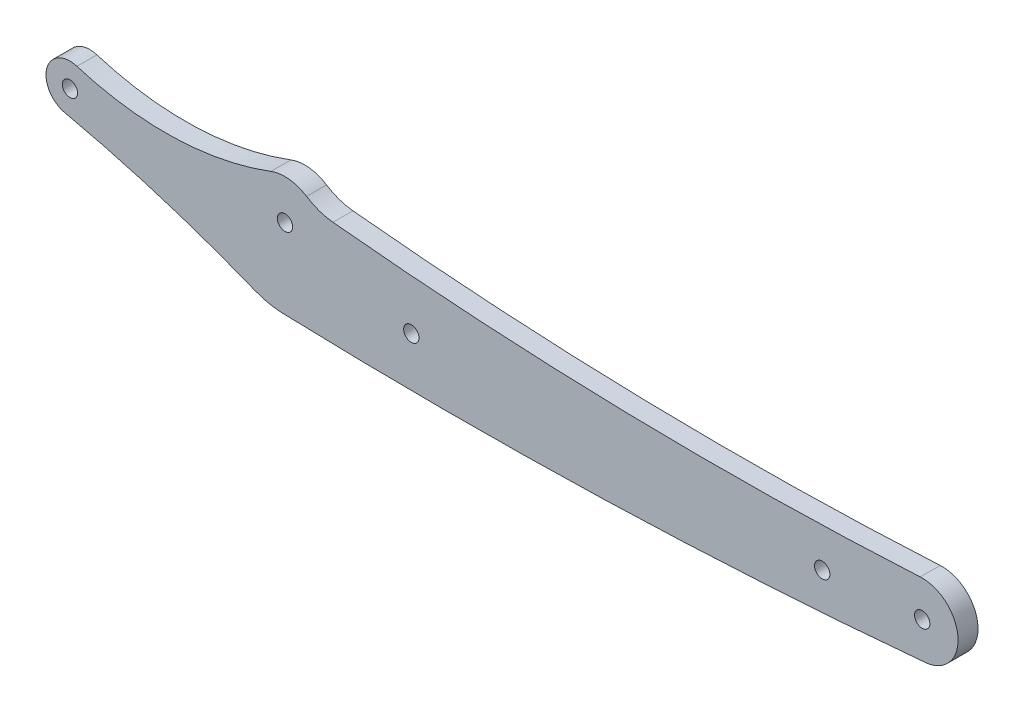
ISO-10303-21;
HEADER;
FILE_DESCRIPTION(('STEP AP214'),'2;1');
FILE_NAME('part.step','',(''),(''),'','','');
FILE_SCHEMA(('AUTOMOTIVE_DESIGN { 1 0 10303 214 1 1 1 1 }'));
ENDSEC;
DATA;
#1=APPLICATION_CONTEXT('core data for automotive mechanical design processes');
#2=APPLICATION_PROTOCOL_DEFINITION('international standard','automotive_design',2000,#1);
#3=PRODUCT_CONTEXT('',#1,'mechanical');
#4=PRODUCT('Part','Part','',(#3));
#5=PRODUCT_RELATED_PRODUCT_CATEGORY('part','',(#4));
#6=PRODUCT_DEFINITION_FORMATION('','',#4);
#7=PRODUCT_DEFINITION_CONTEXT('part definition',#1,'design');
#8=PRODUCT_DEFINITION('design','',#6,#7);
#9=PRODUCT_DEFINITION_SHAPE('','',#8);
#10=(LENGTH_UNIT() NAMED_UNIT(*) SI_UNIT(.MILLI.,.METRE.));
#11=(NAMED_UNIT(*) PLANE_ANGLE_UNIT() SI_UNIT($,.RADIAN.));
#12=(NAMED_UNIT(*) SI_UNIT($,.STERADIAN.) SOLID_ANGLE_UNIT());
#13=UNCERTAINTY_MEASURE_WITH_UNIT(LENGTH_MEASURE(1.E-05),#10,'distance_accuracy_value','');
#14=(GEOMETRIC_REPRESENTATION_CONTEXT(3) GLOBAL_UNCERTAINTY_ASSIGNED_CONTEXT((#13)) GLOBAL_UNIT_ASSIGNED_CONTEXT((#10,
#11,#12)) REPRESENTATION_CONTEXT('',''));
#15=CARTESIAN_POINT('',(0.,0.,0.));
#16=DIRECTION('',(0.,0.,1.));
#17=DIRECTION('',(1.,0.,0.));
#18=AXIS2_PLACEMENT_3D('',#15,#16,#17);
#19=CARTESIAN_POINT('',(78.492038314304,478.023990244628,5.));
#20=DIRECTION('',(0.,0.,1.));
#21=DIRECTION('',(1.,0.,0.));
#22=AXIS2_PLACEMENT_3D('',#19,#20,#21);
#23=PLANE('',#22);
#24=CARTESIAN_POINT('',(-55.1729185121397,5.52644600065499,5.));
#25=DIRECTION('',(0.,0.,1.));
#26=DIRECTION('',(1.,0.,0.));
#27=AXIS2_PLACEMENT_3D('',#24,#25,#26);
#28=CIRCLE('',#27,1.92500000000007);
#29=CARTESIAN_POINT('',(-53.2479185121397,5.52644600065499,5.));
#30=VERTEX_POINT('',#29);
#31=EDGE_CURVE('E209',#30,#30,#28,.T.);
#32=ORIENTED_EDGE('',*,*,#31,.F.);
#33=EDGE_LOOP('',(#32));
#34=FACE_BOUND('',#33,.T.);
#35=CARTESIAN_POINT('',(79.6128747171377,-2.57478498942176,5.));
#36=DIRECTION('',(0.,0.,1.));
#37=DIRECTION('',(1.,0.,0.));
#38=AXIS2_PLACEMENT_3D('',#35,#36,#37);
#39=CIRCLE('',#38,1.92500000000007);
#40=CARTESIAN_POINT('',(81.5378747171378,-2.57478498942176,5.));
#41=VERTEX_POINT('',#40);
#42=EDGE_CURVE('E197',#41,#41,#39,.T.);
#43=ORIENTED_EDGE('',*,*,#42,.F.);
#44=EDGE_LOOP('',(#43));
#45=FACE_BOUND('',#44,.T.);
#46=CARTESIAN_POINT('',(104.703572766013,-0.75905609440774,5.));
#47=DIRECTION('',(0.,0.,1.));
#48=DIRECTION('',(1.,0.,0.));
#49=AXIS2_PLACEMENT_3D('',#46,#47,#48);
#50=CIRCLE('',#49,9.00000000000038);
#51=CARTESIAN_POINT('',(105.525948354053,-9.7214050271488,5.));
#52=VERTEX_POINT('',#51);
#53=CARTESIAN_POINT('',(104.21159401718,8.22748700684695,5.));
#54=VERTEX_POINT('',#53);
#55=EDGE_CURVE('E152',#52,#54,#50,.T.);
#56=ORIENTED_EDGE('',*,*,#55,.T.);
#57=CARTESIAN_POINT('',(52.2805038625947,956.807036583663,5.));
#58=DIRECTION('',(0.,0.,-1.));
#59=DIRECTION('',(1.,0.,0.));
#60=AXIS2_PLACEMENT_3D('',#57,#58,#59);
#61=CIRCLE('',#60,950.);
#62=CARTESIAN_POINT('',(-43.1266054492813,11.6099759170786,5.));
#63=VERTEX_POINT('',#62);
#64=EDGE_CURVE('E95',#54,#63,#61,.T.);
#65=ORIENTED_EDGE('',*,*,#64,.T.);
#66=CARTESIAN_POINT('',(-41.6201774075149,26.5341400328667,5.));
#67=DIRECTION('',(0.,0.,-1.));
#68=DIRECTION('',(1.,0.,0.));
#69=AXIS2_PLACEMENT_3D('',#66,#67,#68);
#70=CIRCLE('',#69,14.9999999999999);
#71=CARTESIAN_POINT('',(-49.751822070291,13.9295236135406,5.));
#72=VERTEX_POINT('',#71);
#73=EDGE_CURVE('E170',#63,#72,#70,.T.);
#74=ORIENTED_EDGE('',*,*,#73,.T.);
#75=CARTESIAN_POINT('',(-55.1729185121397,5.52644600065499,5.));
#76=DIRECTION('',(0.,0.,1.));
#77=DIRECTION('',(1.,0.,0.));
#78=AXIS2_PLACEMENT_3D('',#75,#76,#77);
#79=CIRCLE('',#78,10.0000000000002);
#80=CARTESIAN_POINT('',(-58.7079501836173,14.8807792789627,5.));
#81=VERTEX_POINT('',#80);
#82=EDGE_CURVE('E187',#72,#81,#79,.T.);
#83=ORIENTED_EDGE('',*,*,#82,.T.);
#84=CARTESIAN_POINT('',(-85.2206877197262,85.0382788662583,5.));
#85=DIRECTION('',(0.,0.,-1.));
#86=DIRECTION('',(1.,0.,0.));
#87=AXIS2_PLACEMENT_3D('',#84,#85,#86);
#88=CIRCLE('',#87,74.9999999999998);
#89=CARTESIAN_POINT('',(-107.360082718605,13.3804308028147,5.));
#90=VERTEX_POINT('',#89);
#91=EDGE_CURVE('E186',#81,#90,#88,.T.);
#92=ORIENTED_EDGE('',*,*,#91,.T.);
#93=CARTESIAN_POINT('',(-109.131234318516,7.64780295773893,5.));
#94=DIRECTION('',(0.,0.,1.));
#95=DIRECTION('',(1.,0.,0.));
#96=AXIS2_PLACEMENT_3D('',#93,#94,#95);
#97=CIRCLE('',#96,6.00000000000025);
#98=CARTESIAN_POINT('',(-110.424129779016,1.788756846961,5.));
#99=VERTEX_POINT('',#98);
#100=EDGE_CURVE('E117',#90,#99,#97,.T.);
#101=ORIENTED_EDGE('',*,*,#100,.T.);
#102=CARTESIAN_POINT('',(-175.068902804029,-291.163548691918,5.));
#103=DIRECTION('',(0.,0.,-1.));
#104=DIRECTION('',(1.,0.,0.));
#105=AXIS2_PLACEMENT_3D('',#102,#103,#104);
#106=CIRCLE('',#105,300.);
#107=CARTESIAN_POINT('',(-62.6664175303815,-13.0166786676315,5.));
#108=VERTEX_POINT('',#107);
#109=EDGE_CURVE('E111',#99,#108,#106,.T.);
#110=ORIENTED_EDGE('',*,*,#109,.T.);
#111=CARTESIAN_POINT('',(-55.1729185121397,5.52644600065499,5.));
#112=DIRECTION('',(0.,0.,1.));
#113=DIRECTION('',(1.,0.,0.));
#114=AXIS2_PLACEMENT_3D('',#111,#112,#113);
#115=CIRCLE('',#114,20.0000000000001);
#116=CARTESIAN_POINT('',(-55.8277822922507,-14.4628299599576,5.));
#117=VERTEX_POINT('',#116);
#118=EDGE_CURVE('E115',#108,#117,#115,.T.);
#119=ORIENTED_EDGE('',*,*,#118,.T.);
#120=CARTESIAN_POINT('',(-13.2616365850698,1284.84010747982,5.));
#121=DIRECTION('',(0.,0.,1.));
#122=DIRECTION('',(1.,0.,0.));
#123=AXIS2_PLACEMENT_3D('',#120,#121,#122);
#124=CIRCLE('',#123,1300.);
#125=EDGE_CURVE('E49',#117,#52,#124,.T.);
#126=ORIENTED_EDGE('',*,*,#125,.T.);
#127=EDGE_LOOP('',(#56,#65,#74,#83,#92,#101,#110,#119,#126));
#128=FACE_BOUND('',#127,.T.);
#129=CARTESIAN_POINT('',(-23.4726109731679,-2.72525091177656,5.));
#130=DIRECTION('',(0.,0.,1.));
#131=DIRECTION('',(1.,0.,0.));
#132=AXIS2_PLACEMENT_3D('',#129,#130,#131);
#133=CIRCLE('',#132,1.92500000000007);
#134=CARTESIAN_POINT('',(-21.5476109731678,-2.72525091177656,5.));
#135=VERTEX_POINT('',#134);
#136=EDGE_CURVE('E139',#135,#135,#133,.T.);
#137=ORIENTED_EDGE('',*,*,#136,.F.);
#138=EDGE_LOOP('',(#137));
#139=FACE_BOUND('',#138,.T.);
#140=CARTESIAN_POINT('',(-109.131234318516,7.64780295773893,5.));
#141=DIRECTION('',(0.,0.,1.));
#142=DIRECTION('',(1.,0.,0.));
#143=AXIS2_PLACEMENT_3D('',#140,#141,#142);
#144=CIRCLE('',#143,1.92500000000007);
#145=CARTESIAN_POINT('',(-107.206234318516,7.64780295773893,5.));
#146=VERTEX_POINT('',#145);
#147=EDGE_CURVE('E203',#146,#146,#144,.T.);
#148=ORIENTED_EDGE('',*,*,#147,.F.);
#149=EDGE_LOOP('',(#148));
#150=FACE_BOUND('',#149,.T.);
#151=CARTESIAN_POINT('',(104.703572766013,-0.75905609440774,5.));
#152=DIRECTION('',(0.,0.,1.));
#153=DIRECTION('',(1.,0.,0.));
#154=AXIS2_PLACEMENT_3D('',#151,#152,#153);
#155=CIRCLE('',#154,1.92500000000007);
#156=CARTESIAN_POINT('',(106.628572766013,-0.75905609440774,5.));
#157=VERTEX_POINT('',#156);
#158=EDGE_CURVE('E215',#157,#157,#155,.T.);
#159=ORIENTED_EDGE('',*,*,#158,.F.);
#160=EDGE_LOOP('',(#159));
#161=FACE_BOUND('',#160,.T.);
#162=ADVANCED_FACE('F32',(#34,#45,#128,#139,#150,#161),#23,.T.);
#163=CARTESIAN_POINT('',(78.492038314304,478.023990244628,0.));
#164=DIRECTION('',(0.,0.,1.));
#165=DIRECTION('',(1.,0.,0.));
#166=AXIS2_PLACEMENT_3D('',#163,#164,#165);
#167=PLANE('',#166);
#168=CARTESIAN_POINT('',(104.703572766013,-0.75905609440774,0.));
#169=DIRECTION('',(0.,0.,1.));
#170=DIRECTION('',(1.,0.,0.));
#171=AXIS2_PLACEMENT_3D('',#168,#169,#170);
#172=CIRCLE('',#171,9.00000000000038);
#173=CARTESIAN_POINT('',(105.525948354053,-9.7214050271488,0.));
#174=VERTEX_POINT('',#173);
#175=CARTESIAN_POINT('',(104.21159401718,8.22748700684695,0.));
#176=VERTEX_POINT('',#175);
#177=EDGE_CURVE('E135',#174,#176,#172,.T.);
#178=ORIENTED_EDGE('',*,*,#177,.F.);
#179=CARTESIAN_POINT('',(-13.2616365850698,1284.84010747982,0.));
#180=DIRECTION('',(0.,0.,1.));
#181=DIRECTION('',(1.,0.,0.));
#182=AXIS2_PLACEMENT_3D('',#179,#180,#181);
#183=CIRCLE('',#182,1300.);
#184=CARTESIAN_POINT('',(-55.8277822922507,-14.4628299599576,0.));
#185=VERTEX_POINT('',#184);
#186=EDGE_CURVE('E87',#185,#174,#183,.T.);
#187=ORIENTED_EDGE('',*,*,#186,.F.);
#188=CARTESIAN_POINT('',(-55.1729185121397,5.52644600065499,0.));
#189=DIRECTION('',(0.,0.,1.));
#190=DIRECTION('',(1.,0.,0.));
#191=AXIS2_PLACEMENT_3D('',#188,#189,#190);
#192=CIRCLE('',#191,20.0000000000001);
#193=CARTESIAN_POINT('',(-62.6664175303815,-13.0166786676315,0.));
#194=VERTEX_POINT('',#193);
#195=EDGE_CURVE('E81',#194,#185,#192,.T.);
#196=ORIENTED_EDGE('',*,*,#195,.F.);
#197=CARTESIAN_POINT('',(-175.068902804029,-291.163548691918,0.));
#198=DIRECTION('',(0.,0.,-1.));
#199=DIRECTION('',(1.,0.,0.));
#200=AXIS2_PLACEMENT_3D('',#197,#198,#199);
#201=CIRCLE('',#200,300.);
#202=CARTESIAN_POINT('',(-110.424129779016,1.788756846961,0.));
#203=VERTEX_POINT('',#202);
#204=EDGE_CURVE('E125',#203,#194,#201,.T.);
#205=ORIENTED_EDGE('',*,*,#204,.F.);
#206=CARTESIAN_POINT('',(-109.131234318516,7.64780295773893,0.));
#207=DIRECTION('',(0.,0.,1.));
#208=DIRECTION('',(1.,0.,0.));
#209=AXIS2_PLACEMENT_3D('',#206,#207,#208);
#210=CIRCLE('',#209,6.00000000000025);
#211=CARTESIAN_POINT('',(-107.360082718605,13.3804308028147,0.));
#212=VERTEX_POINT('',#211);
#213=EDGE_CURVE('E147',#212,#203,#210,.T.);
#214=ORIENTED_EDGE('',*,*,#213,.F.);
#215=CARTESIAN_POINT('',(-85.2206877197262,85.0382788662583,0.));
#216=DIRECTION('',(0.,0.,-1.));
#217=DIRECTION('',(1.,0.,0.));
#218=AXIS2_PLACEMENT_3D('',#215,#216,#217);
#219=CIRCLE('',#218,74.9999999999998);
#220=CARTESIAN_POINT('',(-58.7079501836173,14.8807792789627,0.));
#221=VERTEX_POINT('',#220);
#222=EDGE_CURVE('E145',#221,#212,#219,.T.);
#223=ORIENTED_EDGE('',*,*,#222,.F.);
#224=CARTESIAN_POINT('',(-55.1729185121397,5.52644600065499,0.));
#225=DIRECTION('',(0.,0.,1.));
#226=DIRECTION('',(1.,0.,0.));
#227=AXIS2_PLACEMENT_3D('',#224,#225,#226);
#228=CIRCLE('',#227,10.0000000000002);
#229=CARTESIAN_POINT('',(-49.751822070291,13.9295236135406,0.));
#230=VERTEX_POINT('',#229);
#231=EDGE_CURVE('E143',#230,#221,#228,.T.);
#232=ORIENTED_EDGE('',*,*,#231,.F.);
#233=CARTESIAN_POINT('',(-41.6201774075149,26.5341400328667,0.));
#234=DIRECTION('',(0.,0.,-1.));
#235=DIRECTION('',(1.,0.,0.));
#236=AXIS2_PLACEMENT_3D('',#233,#234,#235);
#237=CIRCLE('',#236,14.9999999999999);
#238=CARTESIAN_POINT('',(-43.1266054492813,11.6099759170786,0.));
#239=VERTEX_POINT('',#238);
#240=EDGE_CURVE('E141',#239,#230,#237,.T.);
#241=ORIENTED_EDGE('',*,*,#240,.F.);
#242=CARTESIAN_POINT('',(52.2805038625947,956.807036583663,0.));
#243=DIRECTION('',(0.,0.,-1.));
#244=DIRECTION('',(1.,0.,0.));
#245=AXIS2_PLACEMENT_3D('',#242,#243,#244);
#246=CIRCLE('',#245,950.);
#247=EDGE_CURVE('E138',#176,#239,#246,.T.);
#248=ORIENTED_EDGE('',*,*,#247,.F.);
#249=EDGE_LOOP('',(#178,#187,#196,#205,#214,#223,#232,#241,#248));
#250=FACE_BOUND('',#249,.T.);
#251=CARTESIAN_POINT('',(-23.4726109731679,-2.72525091177656,0.));
#252=DIRECTION('',(0.,0.,1.));
#253=DIRECTION('',(1.,0.,0.));
#254=AXIS2_PLACEMENT_3D('',#251,#252,#253);
#255=CIRCLE('',#254,1.92500000000007);
#256=CARTESIAN_POINT('',(-21.5476109731678,-2.72525091177656,0.));
#257=VERTEX_POINT('',#256);
#258=EDGE_CURVE('E194',#257,#257,#255,.T.);
#259=ORIENTED_EDGE('',*,*,#258,.T.);
#260=EDGE_LOOP('',(#259));
#261=FACE_BOUND('',#260,.T.);
#262=CARTESIAN_POINT('',(79.6128747171377,-2.57478498942176,0.));
#263=DIRECTION('',(0.,0.,1.));
#264=DIRECTION('',(1.,0.,0.));
#265=AXIS2_PLACEMENT_3D('',#262,#263,#264);
#266=CIRCLE('',#265,1.92500000000007);
#267=CARTESIAN_POINT('',(81.5378747171378,-2.57478498942176,0.));
#268=VERTEX_POINT('',#267);
#269=EDGE_CURVE('E200',#268,#268,#266,.T.);
#270=ORIENTED_EDGE('',*,*,#269,.T.);
#271=EDGE_LOOP('',(#270));
#272=FACE_BOUND('',#271,.T.);
#273=CARTESIAN_POINT('',(-109.131234318516,7.64780295773893,0.));
#274=DIRECTION('',(0.,0.,1.));
#275=DIRECTION('',(1.,0.,0.));
#276=AXIS2_PLACEMENT_3D('',#273,#274,#275);
#277=CIRCLE('',#276,1.92500000000007);
#278=CARTESIAN_POINT('',(-107.206234318516,7.64780295773893,0.));
#279=VERTEX_POINT('',#278);
#280=EDGE_CURVE('E206',#279,#279,#277,.T.);
#281=ORIENTED_EDGE('',*,*,#280,.T.);
#282=EDGE_LOOP('',(#281));
#283=FACE_BOUND('',#282,.T.);
#284=CARTESIAN_POINT('',(-55.1729185121397,5.52644600065499,0.));
#285=DIRECTION('',(0.,0.,1.));
#286=DIRECTION('',(1.,0.,0.));
#287=AXIS2_PLACEMENT_3D('',#284,#285,#286);
#288=CIRCLE('',#287,1.92500000000007);
#289=CARTESIAN_POINT('',(-53.2479185121397,5.52644600065499,0.));
#290=VERTEX_POINT('',#289);
#291=EDGE_CURVE('E212',#290,#290,#288,.T.);
#292=ORIENTED_EDGE('',*,*,#291,.T.);
#293=EDGE_LOOP('',(#292));
#294=FACE_BOUND('',#293,.T.);
#295=CARTESIAN_POINT('',(104.703572766013,-0.75905609440774,0.));
#296=DIRECTION('',(0.,0.,1.));
#297=DIRECTION('',(1.,0.,0.));
#298=AXIS2_PLACEMENT_3D('',#295,#296,#297);
#299=CIRCLE('',#298,1.92500000000007);
#300=CARTESIAN_POINT('',(106.628572766013,-0.75905609440774,0.));
#301=VERTEX_POINT('',#300);
#302=EDGE_CURVE('E218',#301,#301,#299,.T.);
#303=ORIENTED_EDGE('',*,*,#302,.T.);
#304=EDGE_LOOP('',(#303));
#305=FACE_BOUND('',#304,.T.);
#306=ADVANCED_FACE('F174',(#250,#261,#272,#283,#294,#305),#167,.F.);
#307=CARTESIAN_POINT('',(104.703572766013,-0.75905609440774,5.));
#308=DIRECTION('',(0.,0.,-1.));
#309=DIRECTION('',(-1.,0.,0.));
#310=AXIS2_PLACEMENT_3D('',#307,#308,#309);
#311=CYLINDRICAL_SURFACE('',#310,9.00000000000038);
#312=ORIENTED_EDGE('',*,*,#177,.T.);
#313=DIRECTION('',(0.,0.,-1.));
#314=VECTOR('',#313,1.);
#315=CARTESIAN_POINT('',(104.21159401718,8.22748700684695,5.));
#316=LINE('',#315,#314);
#317=EDGE_CURVE('E11',#54,#176,#316,.T.);
#318=ORIENTED_EDGE('',*,*,#317,.F.);
#319=ORIENTED_EDGE('',*,*,#55,.F.);
#320=DIRECTION('',(0.,0.,-1.));
#321=VECTOR('',#320,1.);
#322=CARTESIAN_POINT('',(105.525948354053,-9.7214050271488,5.));
#323=LINE('',#322,#321);
#324=EDGE_CURVE('E131',#52,#174,#323,.T.);
#325=ORIENTED_EDGE('',*,*,#324,.T.);
#326=EDGE_LOOP('',(#312,#318,#319,#325));
#327=FACE_BOUND('',#326,.T.);
#328=ADVANCED_FACE('F34',(#327),#311,.T.);
#329=CARTESIAN_POINT('',(52.2805038625947,956.807036583663,5.));
#330=DIRECTION('',(0.,0.,-1.));
#331=DIRECTION('',(-1.,0.,0.));
#332=AXIS2_PLACEMENT_3D('',#329,#330,#331);
#333=CYLINDRICAL_SURFACE('',#332,950.);
#334=ORIENTED_EDGE('',*,*,#247,.T.);
#335=DIRECTION('',(0.,0.,-1.));
#336=VECTOR('',#335,1.);
#337=CARTESIAN_POINT('',(-43.1266054492813,11.6099759170786,5.));
#338=LINE('',#337,#336);
#339=EDGE_CURVE('E41',#63,#239,#338,.T.);
#340=ORIENTED_EDGE('',*,*,#339,.F.);
#341=ORIENTED_EDGE('',*,*,#64,.F.);
#342=ORIENTED_EDGE('',*,*,#317,.T.);
#343=EDGE_LOOP('',(#334,#340,#341,#342));
#344=FACE_BOUND('',#343,.T.);
#345=ADVANCED_FACE('F256',(#344),#333,.F.);
#346=CARTESIAN_POINT('',(-41.6201774075149,26.5341400328667,5.));
#347=DIRECTION('',(0.,0.,-1.));
#348=DIRECTION('',(-1.,0.,0.));
#349=AXIS2_PLACEMENT_3D('',#346,#347,#348);
#350=CYLINDRICAL_SURFACE('',#349,14.9999999999999);
#351=ORIENTED_EDGE('',*,*,#240,.T.);
#352=DIRECTION('',(0.,0.,-1.));
#353=VECTOR('',#352,1.);
#354=CARTESIAN_POINT('',(-49.751822070291,13.9295236135406,5.));
#355=LINE('',#354,#353);
#356=EDGE_CURVE('E162',#72,#230,#355,.T.);
#357=ORIENTED_EDGE('',*,*,#356,.F.);
#358=ORIENTED_EDGE('',*,*,#73,.F.);
#359=ORIENTED_EDGE('',*,*,#339,.T.);
#360=EDGE_LOOP('',(#351,#357,#358,#359));
#361=FACE_BOUND('',#360,.T.);
#362=ADVANCED_FACE('F168',(#361),#350,.F.);
#363=CARTESIAN_POINT('',(-55.1729185121397,5.52644600065499,5.));
#364=DIRECTION('',(0.,0.,-1.));
#365=DIRECTION('',(-1.,0.,0.));
#366=AXIS2_PLACEMENT_3D('',#363,#364,#365);
#367=CYLINDRICAL_SURFACE('',#366,10.0000000000002);
#368=ORIENTED_EDGE('',*,*,#231,.T.);
#369=DIRECTION('',(0.,0.,-1.));
#370=VECTOR('',#369,1.);
#371=CARTESIAN_POINT('',(-58.7079501836173,14.8807792789627,5.));
#372=LINE('',#371,#370);
#373=EDGE_CURVE('E159',#81,#221,#372,.T.);
#374=ORIENTED_EDGE('',*,*,#373,.F.);
#375=ORIENTED_EDGE('',*,*,#82,.F.);
#376=ORIENTED_EDGE('',*,*,#356,.T.);
#377=EDGE_LOOP('',(#368,#374,#375,#376));
#378=FACE_BOUND('',#377,.T.);
#379=ADVANCED_FACE('F180',(#378),#367,.T.);
#380=CARTESIAN_POINT('',(-85.2206877197262,85.0382788662583,5.));
#381=DIRECTION('',(0.,0.,-1.));
#382=DIRECTION('',(-1.,0.,0.));
#383=AXIS2_PLACEMENT_3D('',#380,#381,#382);
#384=CYLINDRICAL_SURFACE('',#383,74.9999999999998);
#385=ORIENTED_EDGE('',*,*,#222,.T.);
#386=DIRECTION('',(0.,0.,-1.));
#387=VECTOR('',#386,1.);
#388=CARTESIAN_POINT('',(-107.360082718605,13.3804308028147,5.));
#389=LINE('',#388,#387);
#390=EDGE_CURVE('E156',#90,#212,#389,.T.);
#391=ORIENTED_EDGE('',*,*,#390,.F.);
#392=ORIENTED_EDGE('',*,*,#91,.F.);
#393=ORIENTED_EDGE('',*,*,#373,.T.);
#394=EDGE_LOOP('',(#385,#391,#392,#393));
#395=FACE_BOUND('',#394,.T.);
#396=ADVANCED_FACE('F184',(#395),#384,.F.);
#397=CARTESIAN_POINT('',(-109.131234318516,7.64780295773893,5.));
#398=DIRECTION('',(0.,0.,-1.));
#399=DIRECTION('',(-1.,0.,0.));
#400=AXIS2_PLACEMENT_3D('',#397,#398,#399);
#401=CYLINDRICAL_SURFACE('',#400,6.00000000000025);
#402=ORIENTED_EDGE('',*,*,#213,.T.);
#403=DIRECTION('',(0.,0.,-1.));
#404=VECTOR('',#403,1.);
#405=CARTESIAN_POINT('',(-110.424129779016,1.788756846961,5.));
#406=LINE('',#405,#404);
#407=EDGE_CURVE('E126',#99,#203,#406,.T.);
#408=ORIENTED_EDGE('',*,*,#407,.F.);
#409=ORIENTED_EDGE('',*,*,#100,.F.);
#410=ORIENTED_EDGE('',*,*,#390,.T.);
#411=EDGE_LOOP('',(#402,#408,#409,#410));
#412=FACE_BOUND('',#411,.T.);
#413=ADVANCED_FACE('F247',(#412),#401,.T.);
#414=CARTESIAN_POINT('',(-175.068902804029,-291.163548691918,5.));
#415=DIRECTION('',(0.,0.,-1.));
#416=DIRECTION('',(-1.,0.,0.));
#417=AXIS2_PLACEMENT_3D('',#414,#415,#416);
#418=CYLINDRICAL_SURFACE('',#417,300.);
#419=ORIENTED_EDGE('',*,*,#204,.T.);
#420=DIRECTION('',(0.,0.,-1.));
#421=VECTOR('',#420,1.);
#422=CARTESIAN_POINT('',(-62.6664175303815,-13.0166786676315,5.));
#423=LINE('',#422,#421);
#424=EDGE_CURVE('E122',#108,#194,#423,.T.);
#425=ORIENTED_EDGE('',*,*,#424,.F.);
#426=ORIENTED_EDGE('',*,*,#109,.F.);
#427=ORIENTED_EDGE('',*,*,#407,.T.);
#428=EDGE_LOOP('',(#419,#425,#426,#427));
#429=FACE_BOUND('',#428,.T.);
#430=ADVANCED_FACE('F123',(#429),#418,.F.);
#431=CARTESIAN_POINT('',(-55.1729185121397,5.52644600065499,5.));
#432=DIRECTION('',(0.,0.,-1.));
#433=DIRECTION('',(-1.,0.,0.));
#434=AXIS2_PLACEMENT_3D('',#431,#432,#433);
#435=CYLINDRICAL_SURFACE('',#434,20.0000000000001);
#436=ORIENTED_EDGE('',*,*,#195,.T.);
#437=DIRECTION('',(0.,0.,-1.));
#438=VECTOR('',#437,1.);
#439=CARTESIAN_POINT('',(-55.8277822922507,-14.4628299599576,5.));
#440=LINE('',#439,#438);
#441=EDGE_CURVE('E127',#117,#185,#440,.T.);
#442=ORIENTED_EDGE('',*,*,#441,.F.);
#443=ORIENTED_EDGE('',*,*,#118,.F.);
#444=ORIENTED_EDGE('',*,*,#424,.T.);
#445=EDGE_LOOP('',(#436,#442,#443,#444));
#446=FACE_BOUND('',#445,.T.);
#447=ADVANCED_FACE('F129',(#446),#435,.T.);
#448=CARTESIAN_POINT('',(-13.2616365850698,1284.84010747982,5.));
#449=DIRECTION('',(0.,0.,-1.));
#450=DIRECTION('',(-1.,0.,0.));
#451=AXIS2_PLACEMENT_3D('',#448,#449,#450);
#452=CYLINDRICAL_SURFACE('',#451,1300.);
#453=ORIENTED_EDGE('',*,*,#186,.T.);
#454=ORIENTED_EDGE('',*,*,#324,.F.);
#455=ORIENTED_EDGE('',*,*,#125,.F.);
#456=ORIENTED_EDGE('',*,*,#441,.T.);
#457=EDGE_LOOP('',(#453,#454,#455,#456));
#458=FACE_BOUND('',#457,.T.);
#459=ADVANCED_FACE('F240',(#458),#452,.T.);
#460=CARTESIAN_POINT('',(-23.4726109731679,-2.72525091177656,5.));
#461=DIRECTION('',(0.,0.,-1.));
#462=DIRECTION('',(-1.,0.,0.));
#463=AXIS2_PLACEMENT_3D('',#460,#461,#462);
#464=CYLINDRICAL_SURFACE('',#463,1.92500000000007);
#465=ORIENTED_EDGE('',*,*,#136,.T.);
#466=EDGE_LOOP('',(#465));
#467=FACE_BOUND('',#466,.T.);
#468=ORIENTED_EDGE('',*,*,#258,.F.);
#469=EDGE_LOOP('',(#468));
#470=FACE_BOUND('',#469,.T.);
#471=ADVANCED_FACE('F237',(#467,#470),#464,.F.);
#472=CARTESIAN_POINT('',(79.6128747171377,-2.57478498942176,5.));
#473=DIRECTION('',(0.,0.,-1.));
#474=DIRECTION('',(-1.,0.,0.));
#475=AXIS2_PLACEMENT_3D('',#472,#473,#474);
#476=CYLINDRICAL_SURFACE('',#475,1.92500000000007);
#477=ORIENTED_EDGE('',*,*,#42,.T.);
#478=EDGE_LOOP('',(#477));
#479=FACE_BOUND('',#478,.T.);
#480=ORIENTED_EDGE('',*,*,#269,.F.);
#481=EDGE_LOOP('',(#480));
#482=FACE_BOUND('',#481,.T.);
#483=ADVANCED_FACE('F325',(#479,#482),#476,.F.);
#484=CARTESIAN_POINT('',(-109.131234318516,7.64780295773893,5.));
#485=DIRECTION('',(0.,0.,-1.));
#486=DIRECTION('',(-1.,0.,0.));
#487=AXIS2_PLACEMENT_3D('',#484,#485,#486);
#488=CYLINDRICAL_SURFACE('',#487,1.92500000000007);
#489=ORIENTED_EDGE('',*,*,#147,.T.);
#490=EDGE_LOOP('',(#489));
#491=FACE_BOUND('',#490,.T.);
#492=ORIENTED_EDGE('',*,*,#280,.F.);
#493=EDGE_LOOP('',(#492));
#494=FACE_BOUND('',#493,.T.);
#495=ADVANCED_FACE('F333',(#491,#494),#488,.F.);
#496=CARTESIAN_POINT('',(-55.1729185121397,5.52644600065499,5.));
#497=DIRECTION('',(0.,0.,-1.));
#498=DIRECTION('',(-1.,0.,0.));
#499=AXIS2_PLACEMENT_3D('',#496,#497,#498);
#500=CYLINDRICAL_SURFACE('',#499,1.92500000000007);
#501=ORIENTED_EDGE('',*,*,#31,.T.);
#502=EDGE_LOOP('',(#501));
#503=FACE_BOUND('',#502,.T.);
#504=ORIENTED_EDGE('',*,*,#291,.F.);
#505=EDGE_LOOP('',(#504));
#506=FACE_BOUND('',#505,.T.);
#507=ADVANCED_FACE('F341',(#503,#506),#500,.F.);
#508=CARTESIAN_POINT('',(104.703572766013,-0.75905609440774,5.));
#509=DIRECTION('',(0.,0.,-1.));
#510=DIRECTION('',(-1.,0.,0.));
#511=AXIS2_PLACEMENT_3D('',#508,#509,#510);
#512=CYLINDRICAL_SURFACE('',#511,1.92500000000007);
#513=ORIENTED_EDGE('',*,*,#158,.T.);
#514=EDGE_LOOP('',(#513));
#515=FACE_BOUND('',#514,.T.);
#516=ORIENTED_EDGE('',*,*,#302,.F.);
#517=EDGE_LOOP('',(#516));
#518=FACE_BOUND('',#517,.T.);
#519=ADVANCED_FACE('F224',(#515,#518),#512,.F.);
#520=CLOSED_SHELL('',(#162,#306,#328,#345,#362,#379,#396,#413,#430,#447,#459,#471,#483,#495,
#507,#519));
#521=MANIFOLD_SOLID_BREP('B2',#520);
#522=ADVANCED_BREP_SHAPE_REPRESENTATION('',(#18,#521),#14);
#523=SHAPE_DEFINITION_REPRESENTATION(#9,#522);
ENDSEC;
END-ISO-10303-21;
